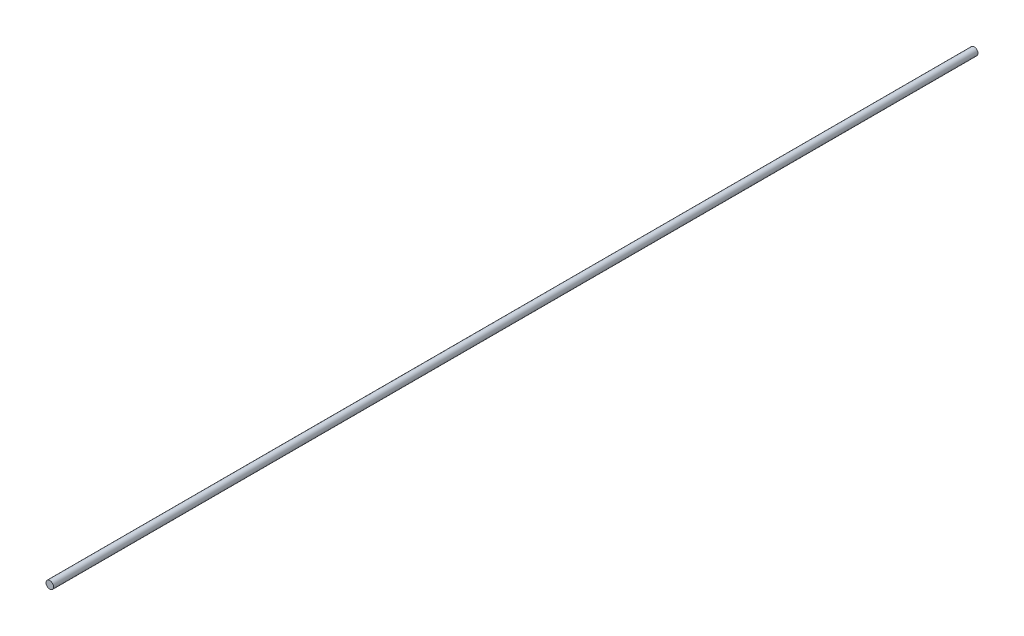
ISO-10303-21;
HEADER;
FILE_DESCRIPTION(('STEP AP214'),'2;1');
FILE_NAME('part.step','',(''),(''),'','','');
FILE_SCHEMA(('AUTOMOTIVE_DESIGN { 1 0 10303 214 1 1 1 1 }'));
ENDSEC;
DATA;
#1=APPLICATION_CONTEXT('core data for automotive mechanical design processes');
#2=APPLICATION_PROTOCOL_DEFINITION('international standard','automotive_design',2000,#1);
#3=PRODUCT_CONTEXT('',#1,'mechanical');
#4=PRODUCT('Part','Part','',(#3));
#5=PRODUCT_RELATED_PRODUCT_CATEGORY('part','',(#4));
#6=PRODUCT_DEFINITION_FORMATION('','',#4);
#7=PRODUCT_DEFINITION_CONTEXT('part definition',#1,'design');
#8=PRODUCT_DEFINITION('design','',#6,#7);
#9=PRODUCT_DEFINITION_SHAPE('','',#8);
#10=(LENGTH_UNIT() NAMED_UNIT(*) SI_UNIT(.MILLI.,.METRE.));
#11=(NAMED_UNIT(*) PLANE_ANGLE_UNIT() SI_UNIT($,.RADIAN.));
#12=(NAMED_UNIT(*) SI_UNIT($,.STERADIAN.) SOLID_ANGLE_UNIT());
#13=UNCERTAINTY_MEASURE_WITH_UNIT(LENGTH_MEASURE(1.E-05),#10,'distance_accuracy_value','');
#14=(GEOMETRIC_REPRESENTATION_CONTEXT(3) GLOBAL_UNCERTAINTY_ASSIGNED_CONTEXT((#13)) GLOBAL_UNIT_ASSIGNED_CONTEXT((#10,
#11,#12)) REPRESENTATION_CONTEXT('',''));
#15=CARTESIAN_POINT('',(0.,0.,0.));
#16=DIRECTION('',(0.,0.,1.));
#17=DIRECTION('',(1.,0.,0.));
#18=AXIS2_PLACEMENT_3D('',#15,#16,#17);
#19=CARTESIAN_POINT('',(0.,0.,610.));
#20=DIRECTION('',(0.,0.,-1.));
#21=DIRECTION('',(-1.,0.,0.));
#22=AXIS2_PLACEMENT_3D('',#19,#20,#21);
#23=CYLINDRICAL_SURFACE('',#22,2.5);
#24=CARTESIAN_POINT('',(0.,0.,610.));
#25=DIRECTION('',(0.,0.,1.));
#26=DIRECTION('',(1.,0.,0.));
#27=AXIS2_PLACEMENT_3D('',#24,#25,#26);
#28=CIRCLE('',#27,2.5);
#29=CARTESIAN_POINT('',(2.5,0.,610.));
#30=VERTEX_POINT('',#29);
#31=EDGE_CURVE('E10',#30,#30,#28,.T.);
#32=ORIENTED_EDGE('',*,*,#31,.F.);
#33=EDGE_LOOP('',(#32));
#34=FACE_BOUND('',#33,.T.);
#35=CARTESIAN_POINT('',(0.,0.,0.));
#36=DIRECTION('',(0.,0.,1.));
#37=DIRECTION('',(1.,0.,0.));
#38=AXIS2_PLACEMENT_3D('',#35,#36,#37);
#39=CIRCLE('',#38,2.5);
#40=CARTESIAN_POINT('',(2.5,0.,0.));
#41=VERTEX_POINT('',#40);
#42=EDGE_CURVE('E37',#41,#41,#39,.T.);
#43=ORIENTED_EDGE('',*,*,#42,.T.);
#44=EDGE_LOOP('',(#43));
#45=FACE_BOUND('',#44,.T.);
#46=ADVANCED_FACE('F34',(#34,#45),#23,.T.);
#47=CARTESIAN_POINT('',(0.,0.,610.));
#48=DIRECTION('',(0.,0.,1.));
#49=DIRECTION('',(1.,0.,0.));
#50=AXIS2_PLACEMENT_3D('',#47,#48,#49);
#51=PLANE('',#50);
#52=ORIENTED_EDGE('',*,*,#31,.T.);
#53=EDGE_LOOP('',(#52));
#54=FACE_BOUND('',#53,.T.);
#55=ADVANCED_FACE('F49',(#54),#51,.T.);
#56=CARTESIAN_POINT('',(0.,0.,0.));
#57=DIRECTION('',(0.,0.,1.));
#58=DIRECTION('',(1.,0.,0.));
#59=AXIS2_PLACEMENT_3D('',#56,#57,#58);
#60=PLANE('',#59);
#61=ORIENTED_EDGE('',*,*,#42,.F.);
#62=EDGE_LOOP('',(#61));
#63=FACE_BOUND('',#62,.T.);
#64=ADVANCED_FACE('F47',(#63),#60,.F.);
#65=CLOSED_SHELL('',(#46,#55,#64));
#66=MANIFOLD_SOLID_BREP('B2',#65);
#67=ADVANCED_BREP_SHAPE_REPRESENTATION('',(#18,#66),#14);
#68=SHAPE_DEFINITION_REPRESENTATION(#9,#67);
ENDSEC;
END-ISO-10303-21;
